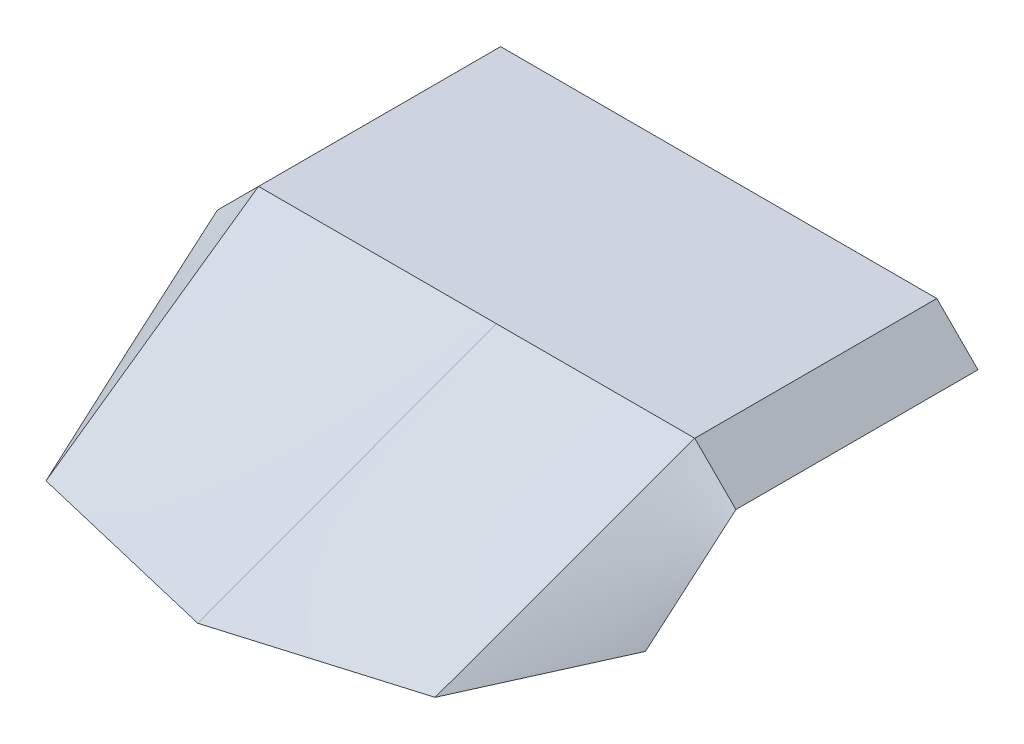
ISO-10303-21;
HEADER;
FILE_DESCRIPTION(('STEP AP214'),'2;1');
FILE_NAME('part.step','',(''),(''),'','','');
FILE_SCHEMA(('AUTOMOTIVE_DESIGN { 1 0 10303 214 1 1 1 1 }'));
ENDSEC;
DATA;
#1=APPLICATION_CONTEXT('core data for automotive mechanical design processes');
#2=APPLICATION_PROTOCOL_DEFINITION('international standard','automotive_design',2000,#1);
#3=PRODUCT_CONTEXT('',#1,'mechanical');
#4=PRODUCT('Part','Part','',(#3));
#5=PRODUCT_RELATED_PRODUCT_CATEGORY('part','',(#4));
#6=PRODUCT_DEFINITION_FORMATION('','',#4);
#7=PRODUCT_DEFINITION_CONTEXT('part definition',#1,'design');
#8=PRODUCT_DEFINITION('design','',#6,#7);
#9=PRODUCT_DEFINITION_SHAPE('','',#8);
#10=(LENGTH_UNIT() NAMED_UNIT(*) SI_UNIT(.MILLI.,.METRE.));
#11=(NAMED_UNIT(*) PLANE_ANGLE_UNIT() SI_UNIT($,.RADIAN.));
#12=(NAMED_UNIT(*) SI_UNIT($,.STERADIAN.) SOLID_ANGLE_UNIT());
#13=UNCERTAINTY_MEASURE_WITH_UNIT(LENGTH_MEASURE(1.E-05),#10,'distance_accuracy_value','');
#14=(GEOMETRIC_REPRESENTATION_CONTEXT(3) GLOBAL_UNCERTAINTY_ASSIGNED_CONTEXT((#13)) GLOBAL_UNIT_ASSIGNED_CONTEXT((#10,
#11,#12)) REPRESENTATION_CONTEXT('',''));
#15=CARTESIAN_POINT('',(0.,0.,0.));
#16=DIRECTION('',(0.,0.,1.));
#17=DIRECTION('',(1.,0.,0.));
#18=AXIS2_PLACEMENT_3D('',#15,#16,#17);
#19=CARTESIAN_POINT('',(0.,0.,30.));
#20=DIRECTION('',(0.,0.,1.));
#21=DIRECTION('',(1.,0.,0.));
#22=AXIS2_PLACEMENT_3D('',#19,#20,#21);
#23=PLANE('',#22);
#24=DIRECTION('',(-1.,0.,0.));
#25=VECTOR('',#24,1.);
#26=CARTESIAN_POINT('',(60.7145340187775,34.7887257541146,30.));
#27=LINE('',#26,#25);
#28=CARTESIAN_POINT('',(60.7145340187775,34.7887257541146,30.));
#29=VERTEX_POINT('',#28);
#30=CARTESIAN_POINT('',(-67.6565337930879,34.7887257541146,30.));
#31=VERTEX_POINT('',#30);
#32=EDGE_CURVE('E215',#29,#31,#27,.T.);
#33=ORIENTED_EDGE('',*,*,#32,.T.);
#34=DIRECTION('',(-0.707106781186547,-0.707106781186548,0.));
#35=VECTOR('',#34,1.);
#36=CARTESIAN_POINT('',(-67.6565337930879,34.7887257541146,30.));
#37=LINE('',#36,#35);
#38=CARTESIAN_POINT('',(-79.74918503639,22.6960745108126,30.));
#39=VERTEX_POINT('',#38);
#40=EDGE_CURVE('E74',#31,#39,#37,.T.);
#41=ORIENTED_EDGE('',*,*,#40,.T.);
#42=DIRECTION('',(0.923879532511283,-0.382683432365098,0.));
#43=VECTOR('',#42,1.);
#44=CARTESIAN_POINT('',(-79.7554783372609,22.6986812813854,30.));
#45=LINE('',#44,#43);
#46=CARTESIAN_POINT('',(-79.7554783372609,22.6986812813854,30.));
#47=VERTEX_POINT('',#46);
#48=EDGE_CURVE('E390',#47,#39,#45,.T.);
#49=ORIENTED_EDGE('',*,*,#48,.F.);
#50=DIRECTION('',(-0.707106781186547,-0.707106781186548,0.));
#51=VECTOR('',#50,1.);
#52=CARTESIAN_POINT('',(-67.6410122431936,34.8131473754527,30.));
#53=LINE('',#52,#51);
#54=CARTESIAN_POINT('',(-67.6410122431936,34.8131473754527,30.));
#55=VERTEX_POINT('',#54);
#56=EDGE_CURVE('E422',#55,#47,#53,.T.);
#57=ORIENTED_EDGE('',*,*,#56,.F.);
#58=DIRECTION('',(-1.,0.,0.));
#59=VECTOR('',#58,1.);
#60=CARTESIAN_POINT('',(60.7300555686718,34.8131473754527,30.));
#61=LINE('',#60,#59);
#62=CARTESIAN_POINT('',(2.36540760200717,34.8131473754527,30.));
#63=VERTEX_POINT('',#62);
#64=EDGE_CURVE('E772',#63,#55,#61,.T.);
#65=ORIENTED_EDGE('',*,*,#64,.F.);
#66=CARTESIAN_POINT('',(60.7300555686718,34.8131473754527,30.));
#67=VERTEX_POINT('',#66);
#68=EDGE_CURVE('E66',#67,#63,#61,.T.);
#69=ORIENTED_EDGE('',*,*,#68,.F.);
#70=DIRECTION('',(-0.707106781186548,0.707106781186548,0.));
#71=VECTOR('',#70,1.);
#72=CARTESIAN_POINT('',(72.844521662739,22.6986812813854,30.));
#73=LINE('',#72,#71);
#74=CARTESIAN_POINT('',(72.844521662739,22.6986812813854,30.));
#75=VERTEX_POINT('',#74);
#76=EDGE_CURVE('E675',#75,#67,#73,.T.);
#77=ORIENTED_EDGE('',*,*,#76,.F.);
#78=DIRECTION('',(0.923879532511285,0.382683432365094,0.));
#79=VECTOR('',#78,1.);
#80=CARTESIAN_POINT('',(67.8445216627391,20.62761346952,30.));
#81=LINE('',#80,#79);
#82=CARTESIAN_POINT('',(72.8162775754986,22.6869821973936,30.));
#83=VERTEX_POINT('',#82);
#84=EDGE_CURVE('E382',#83,#75,#81,.T.);
#85=ORIENTED_EDGE('',*,*,#84,.F.);
#86=DIRECTION('',(-0.707106781186547,0.707106781186547,0.));
#87=VECTOR('',#86,1.);
#88=CARTESIAN_POINT('',(72.8290001128448,22.6742596600474,30.));
#89=LINE('',#88,#87);
#90=EDGE_CURVE('E12',#83,#29,#89,.T.);
#91=ORIENTED_EDGE('',*,*,#90,.T.);
#92=EDGE_LOOP('',(#33,#41,#49,#57,#65,#69,#77,#85,#91));
#93=FACE_BOUND('',#92,.T.);
#94=ADVANCED_FACE('F56',(#93),#23,.F.);
#95=CARTESIAN_POINT('',(0.,0.,0.));
#96=DIRECTION('',(0.,-1.,0.));
#97=DIRECTION('',(0.,0.,-1.));
#98=AXIS2_PLACEMENT_3D('',#95,#96,#97);
#99=PLANE('',#98);
#100=DIRECTION('',(0.423612529517882,0.,0.905843488046065));
#101=VECTOR('',#100,1.);
#102=CARTESIAN_POINT('',(-58.677658095292,0.,101.503111576714));
#103=LINE('',#102,#101);
#104=CARTESIAN_POINT('',(-79.6036277648684,0.,56.7554895509702));
#105=VERTEX_POINT('',#104);
#106=CARTESIAN_POINT('',(-58.677658095292,0.,101.503111576714));
#107=VERTEX_POINT('',#106);
#108=EDGE_CURVE('E255',#105,#107,#103,.T.);
#109=ORIENTED_EDGE('',*,*,#108,.F.);
#110=DIRECTION('',(-1.,0.,0.));
#111=VECTOR('',#110,1.);
#112=CARTESIAN_POINT('',(-79.6036277648684,0.,56.7554895509702));
#113=LINE('',#112,#111);
#114=CARTESIAN_POINT('',(-74.6036277648684,0.,56.7554895509702));
#115=VERTEX_POINT('',#114);
#116=EDGE_CURVE('E595',#115,#105,#113,.T.);
#117=ORIENTED_EDGE('',*,*,#116,.F.);
#118=DIRECTION('',(-0.433093550106812,0.,-0.901348976177306));
#119=VECTOR('',#118,1.);
#120=CARTESIAN_POINT('',(-74.6036277648684,0.,56.7554895509702));
#121=LINE('',#120,#119);
#122=CARTESIAN_POINT('',(-55.1709183458875,0.,97.1986056741027));
#123=VERTEX_POINT('',#122);
#124=EDGE_CURVE('E583',#123,#115,#121,.T.);
#125=ORIENTED_EDGE('',*,*,#124,.F.);
#126=DIRECTION('',(-0.972775791288033,0.,-0.231748268351547));
#127=VECTOR('',#126,1.);
#128=CARTESIAN_POINT('',(-55.1709183458875,0.,97.1986056741027));
#129=LINE('',#128,#127);
#130=CARTESIAN_POINT('',(-0.195472783590218,0.,110.295625999873));
#131=VERTEX_POINT('',#130);
#132=EDGE_CURVE('E756',#131,#123,#129,.T.);
#133=ORIENTED_EDGE('',*,*,#132,.F.);
#134=DIRECTION('',(-0.958322681617719,0.,0.285688007968523));
#135=VECTOR('',#134,1.);
#136=CARTESIAN_POINT('',(-0.195472783590218,0.,110.295625999873));
#137=LINE('',#136,#135);
#138=CARTESIAN_POINT('',(50.137838924741,0.,95.2906346412864));
#139=VERTEX_POINT('',#138);
#140=EDGE_CURVE('E509',#139,#131,#137,.T.);
#141=ORIENTED_EDGE('',*,*,#140,.F.);
#142=DIRECTION('',(-0.420476191987089,0.,0.907303572114668));
#143=VECTOR('',#142,1.);
#144=CARTESIAN_POINT('',(50.137838924741,0.,95.2906346412864));
#145=LINE('',#144,#143);
#146=CARTESIAN_POINT('',(67.9963722351316,0.,56.7554895509701));
#147=VERTEX_POINT('',#146);
#148=EDGE_CURVE('E494',#147,#139,#145,.T.);
#149=ORIENTED_EDGE('',*,*,#148,.F.);
#150=DIRECTION('',(-1.,0.,0.));
#151=VECTOR('',#150,1.);
#152=CARTESIAN_POINT('',(67.9963722351316,0.,56.7554895509701));
#153=LINE('',#152,#151);
#154=CARTESIAN_POINT('',(72.9963722351316,0.,56.7554895509701));
#155=VERTEX_POINT('',#154);
#156=EDGE_CURVE('E677',#155,#147,#153,.T.);
#157=ORIENTED_EDGE('',*,*,#156,.F.);
#158=DIRECTION('',(0.411014378129852,0.,-0.911628861418138));
#159=VECTOR('',#158,1.);
#160=CARTESIAN_POINT('',(72.9963722351316,0.,56.7554895509701));
#161=LINE('',#160,#159);
#162=CARTESIAN_POINT('',(53.7565845323103,0.,99.4292904950052));
#163=VERTEX_POINT('',#162);
#164=EDGE_CURVE('E665',#163,#155,#161,.T.);
#165=ORIENTED_EDGE('',*,*,#164,.F.);
#166=DIRECTION('',(0.95832268161772,0.,-0.285688007968523));
#167=VECTOR('',#166,1.);
#168=CARTESIAN_POINT('',(53.7565845323103,0.,99.4292904950052));
#169=LINE('',#168,#167);
#170=CARTESIAN_POINT('',(-0.0509416868879859,0.,115.469988763074));
#171=VERTEX_POINT('',#170);
#172=EDGE_CURVE('E763',#171,#163,#169,.T.);
#173=ORIENTED_EDGE('',*,*,#172,.F.);
#174=DIRECTION('',(0.972775791288033,0.,0.231748268351548));
#175=VECTOR('',#174,1.);
#176=CARTESIAN_POINT('',(-0.0509416868879859,0.,115.469988763074));
#177=LINE('',#176,#175);
#178=EDGE_CURVE('E321',#107,#171,#177,.T.);
#179=ORIENTED_EDGE('',*,*,#178,.F.);
#180=EDGE_LOOP('',(#109,#117,#125,#133,#141,#149,#157,#165,#173,#179));
#181=FACE_BOUND('',#180,.T.);
#182=ADVANCED_FACE('F680',(#181),#99,.T.);
#183=CARTESIAN_POINT('',(-79.6036277648684,0.,56.7554895509702));
#184=CARTESIAN_POINT('',(-79.7554783372609,22.6986812813854,30.));
#185=CARTESIAN_POINT('',(-76.1159661532723,0.,64.2134265552608));
#186=CARTESIAN_POINT('',(-77.7364006549163,24.71775896373,30.));
#187=CARTESIAN_POINT('',(-72.6283045416763,0.,71.6713635595513));
#188=CARTESIAN_POINT('',(-75.7173229725717,26.7368366460746,30.));
#189=CARTESIAN_POINT('',(-65.6529813184841,0.,86.5872375681325));
#190=CARTESIAN_POINT('',(-71.6791676078826,30.7749920107637,30.));
#191=CARTESIAN_POINT('',(-62.165319706888,0.,94.0451745724231));
#192=CARTESIAN_POINT('',(-69.6600899255381,32.7940696931082,30.));
#193=CARTESIAN_POINT('',(-58.677658095292,0.,101.503111576714));
#194=CARTESIAN_POINT('',(-67.6410122431936,34.8131473754527,30.));
#195=B_SPLINE_SURFACE_WITH_KNOTS('',3,1,((#183,#184),(#185,#186),(#187,#188),(#189,#190),(#191,
#192),(#193,#194)),.UNSPECIFIED.,.F.,.F.,.F.,(4,2,4),(2,2),(0.,0.5,1.),(0.,1.),.UNSPECIFIED.);
#196=DIRECTION('',(-0.111998256804426,0.434994730275054,-0.893440526899078));
#197=VECTOR('',#196,1.);
#198=CARTESIAN_POINT('',(-63.1593351692428,17.4065736877263,65.7515557883568));
#199=LINE('',#198,#197);
#200=EDGE_CURVE('E327',#107,#55,#199,.T.);
#201=DIRECTION('',(0.00432780921793199,-0.646922566946734,0.762543416758956));
#202=VECTOR('',#201,1.);
#203=CARTESIAN_POINT('',(-79.6795530510646,11.3493406406927,43.3777447754851));
#204=LINE('',#203,#202);
#205=EDGE_CURVE('E600',#47,#105,#204,.T.);
#206=ORIENTED_EDGE('',*,*,#108,.T.);
#207=ORIENTED_EDGE('',*,*,#200,.T.);
#208=ORIENTED_EDGE('',*,*,#56,.T.);
#209=ORIENTED_EDGE('',*,*,#205,.T.);
#210=EDGE_LOOP('',(#206,#207,#208,#209));
#211=FACE_BOUND('',#210,.T.);
#212=ADVANCED_FACE('F342',(#211),#195,.T.);
#213=CARTESIAN_POINT('',(-58.677658095292,0.,101.503111576714));
#214=CARTESIAN_POINT('',(-67.6410122431936,34.8131473754527,30.));
#215=CARTESIAN_POINT('',(-48.9065386938913,0.,103.830924441107));
#216=CARTESIAN_POINT('',(-55.9732756023268,34.8131473754526,30.));
#217=CARTESIAN_POINT('',(-39.1354192924906,0.,106.158737305501));
#218=CARTESIAN_POINT('',(-44.30553896146,34.8131473754527,30.));
#219=CARTESIAN_POINT('',(-19.5931804896893,0.,110.814363034288));
#220=CARTESIAN_POINT('',(-20.9700656797264,34.8131473754527,30.));
#221=CARTESIAN_POINT('',(-9.82206108828865,0.,113.142175898681));
#222=CARTESIAN_POINT('',(-9.30232903885959,34.8131473754527,30.));
#223=CARTESIAN_POINT('',(-0.0509416868879859,0.,115.469988763074));
#224=CARTESIAN_POINT('',(2.36540760200717,34.8131473754527,30.));
#225=B_SPLINE_SURFACE_WITH_KNOTS('',3,1,((#213,#214),(#215,#216),(#217,#218),(#219,#220),(#221,
#222),(#223,#224)),.UNSPECIFIED.,.F.,.F.,.F.,(4,2,4),(2,2),(0.,0.5,1.),(0.,1.),.UNSPECIFIED.);
#226=DIRECTION('',(0.026173734113693,0.377093687263458,-0.92580520989493));
#227=VECTOR('',#226,1.);
#228=CARTESIAN_POINT('',(1.15723295755959,17.4065736877263,72.7349943815372));
#229=LINE('',#228,#227);
#230=EDGE_CURVE('E82',#171,#63,#229,.T.);
#231=ORIENTED_EDGE('',*,*,#178,.T.);
#232=ORIENTED_EDGE('',*,*,#230,.T.);
#233=ORIENTED_EDGE('',*,*,#64,.T.);
#234=ORIENTED_EDGE('',*,*,#200,.F.);
#235=EDGE_LOOP('',(#231,#232,#233,#234));
#236=FACE_BOUND('',#235,.T.);
#237=ADVANCED_FACE('F329',(#236),#225,.T.);
#238=CARTESIAN_POINT('',(-74.6036277648684,0.,56.7554895509702));
#239=CARTESIAN_POINT('',(-74.7554783372608,20.6276134695198,30.));
#240=CARTESIAN_POINT('',(-75.4369610982016,0.,56.7554895509702));
#241=CARTESIAN_POINT('',(-75.5888116705941,20.9727914381641,30.));
#242=CARTESIAN_POINT('',(-76.2702944315349,0.,56.7554895509702));
#243=CARTESIAN_POINT('',(-76.4221450039275,21.3179694068083,30.));
#244=CARTESIAN_POINT('',(-77.9369610982016,0.,56.7554895509702));
#245=CARTESIAN_POINT('',(-78.0888116705942,22.0083253440969,30.));
#246=CARTESIAN_POINT('',(-78.770294431535,0.,56.7554895509702));
#247=CARTESIAN_POINT('',(-78.9221450039275,22.3535033127411,30.));
#248=CARTESIAN_POINT('',(-79.6036277648684,0.,56.7554895509702));
#249=CARTESIAN_POINT('',(-79.7554783372609,22.6986812813854,30.));
#250=B_SPLINE_SURFACE_WITH_KNOTS('',3,1,((#238,#239),(#240,#241),(#242,#243),(#244,#245),(#246,
#247),(#248,#249)),.UNSPECIFIED.,.F.,.F.,.F.,(4,2,4),(2,2),(0.,0.5,1.),(0.,1.),.UNSPECIFIED.);
#251=CARTESIAN_POINT('',(-74.7554783372608,20.6276134695198,30.));
#252=VERTEX_POINT('',#251);
#253=EDGE_CURVE('E269',#39,#252,#45,.T.);
#254=DIRECTION('',(-0.00449471064483145,0.610568352678392,-0.791950809257629));
#255=VECTOR('',#254,1.);
#256=CARTESIAN_POINT('',(-74.6795530510646,10.3138067347599,43.3777447754851));
#257=LINE('',#256,#255);
#258=EDGE_CURVE('E580',#115,#252,#257,.T.);
#259=ORIENTED_EDGE('',*,*,#116,.T.);
#260=ORIENTED_EDGE('',*,*,#205,.F.);
#261=ORIENTED_EDGE('',*,*,#48,.T.);
#262=ORIENTED_EDGE('',*,*,#253,.T.);
#263=ORIENTED_EDGE('',*,*,#258,.F.);
#264=EDGE_LOOP('',(#259,#260,#261,#262,#263));
#265=FACE_BOUND('',#264,.T.);
#266=ADVANCED_FACE('F341',(#265),#250,.T.);
#267=CARTESIAN_POINT('',(-0.0509416868879828,0.,115.469988763074));
#268=CARTESIAN_POINT('',(2.36540760200717,34.8131473754527,30.));
#269=CARTESIAN_POINT('',(8.91697934964507,0.,112.79653905173));
#270=CARTESIAN_POINT('',(12.0928489297846,34.8131473754527,30.));
#271=CARTESIAN_POINT('',(17.8849003861781,0.,110.123089340385));
#272=CARTESIAN_POINT('',(21.8202902575621,34.8131473754527,30.));
#273=CARTESIAN_POINT('',(35.8207424592442,0.,104.776189917695));
#274=CARTESIAN_POINT('',(41.275172913117,34.8131473754527,30.));
#275=CARTESIAN_POINT('',(44.7886634957772,0.,102.10274020635));
#276=CARTESIAN_POINT('',(51.0026142408944,34.8131473754527,30.));
#277=CARTESIAN_POINT('',(53.7565845323103,0.,99.4292904950052));
#278=CARTESIAN_POINT('',(60.7300555686718,34.8131473754527,30.));
#279=B_SPLINE_SURFACE_WITH_KNOTS('',3,1,((#267,#268),(#269,#270),(#271,#272),(#273,#274),(#275,
#276),(#277,#278)),.UNSPECIFIED.,.F.,.F.,.F.,(4,2,4),(2,2),(0.,0.5,1.),(0.,1.),.UNSPECIFIED.);
#280=DIRECTION('',(0.0894254450586048,0.446432082632551,-0.890337849005889));
#281=VECTOR('',#280,1.);
#282=CARTESIAN_POINT('',(57.2433200504911,17.4065736877263,64.7146452475026));
#283=LINE('',#282,#281);
#284=EDGE_CURVE('E651',#163,#67,#283,.T.);
#285=ORIENTED_EDGE('',*,*,#172,.T.);
#286=ORIENTED_EDGE('',*,*,#284,.T.);
#287=ORIENTED_EDGE('',*,*,#68,.T.);
#288=ORIENTED_EDGE('',*,*,#230,.F.);
#289=EDGE_LOOP('',(#285,#286,#287,#288));
#290=FACE_BOUND('',#289,.T.);
#291=ADVANCED_FACE('F629',(#290),#279,.T.);
#292=CARTESIAN_POINT('',(53.7565845323103,0.,99.4292904950052));
#293=CARTESIAN_POINT('',(60.7300555686718,34.8131473754527,30.));
#294=CARTESIAN_POINT('',(56.9632158161138,0.,92.316990337666));
#295=CARTESIAN_POINT('',(62.7491332510163,32.7940696931081,30.));
#296=CARTESIAN_POINT('',(60.1698470999174,0.,85.2046901803268));
#297=CARTESIAN_POINT('',(64.7682109333609,30.7749920107636,30.));
#298=CARTESIAN_POINT('',(66.5831096675245,0.,70.9800898656485));
#299=CARTESIAN_POINT('',(68.8063662980499,26.7368366460745,30.));
#300=CARTESIAN_POINT('',(69.789740951328,0.,63.8677897083093));
#301=CARTESIAN_POINT('',(70.8254439803945,24.71775896373,30.));
#302=CARTESIAN_POINT('',(72.9963722351316,0.,56.7554895509701));
#303=CARTESIAN_POINT('',(72.844521662739,22.6986812813854,30.));
#304=B_SPLINE_SURFACE_WITH_KNOTS('',3,1,((#292,#293),(#294,#295),(#296,#297),(#298,#299),(#300,
#301),(#302,#303)),.UNSPECIFIED.,.F.,.F.,.F.,(4,2,4),(2,2),(0.,0.5,1.),(0.,1.),.UNSPECIFIED.);
#305=DIRECTION('',(-0.00432780921793279,0.646922566946736,-0.762543416758954));
#306=VECTOR('',#305,1.);
#307=CARTESIAN_POINT('',(72.9204469489353,11.3493406406927,43.3777447754851));
#308=LINE('',#307,#306);
#309=EDGE_CURVE('E487',#155,#75,#308,.T.);
#310=ORIENTED_EDGE('',*,*,#164,.T.);
#311=ORIENTED_EDGE('',*,*,#309,.T.);
#312=ORIENTED_EDGE('',*,*,#76,.T.);
#313=ORIENTED_EDGE('',*,*,#284,.F.);
#314=EDGE_LOOP('',(#310,#311,#312,#313));
#315=FACE_BOUND('',#314,.T.);
#316=ADVANCED_FACE('F458',(#315),#304,.T.);
#317=CARTESIAN_POINT('',(72.9963722351316,0.,56.7554895509701));
#318=CARTESIAN_POINT('',(72.844521662739,22.6986812813854,30.));
#319=CARTESIAN_POINT('',(72.1630389017982,0.,56.7554895509701));
#320=CARTESIAN_POINT('',(72.0111883294057,22.3535033127412,30.));
#321=CARTESIAN_POINT('',(71.3297055684648,0.,56.7554895509701));
#322=CARTESIAN_POINT('',(71.1778549960724,22.008325344097,30.));
#323=CARTESIAN_POINT('',(69.6630389017982,0.,56.7554895509701));
#324=CARTESIAN_POINT('',(69.5111883294057,21.3179694068085,30.));
#325=CARTESIAN_POINT('',(68.8297055684649,0.,56.7554895509701));
#326=CARTESIAN_POINT('',(68.6778549960724,20.9727914381642,30.));
#327=CARTESIAN_POINT('',(67.9963722351316,0.,56.7554895509701));
#328=CARTESIAN_POINT('',(67.8445216627391,20.62761346952,30.));
#329=B_SPLINE_SURFACE_WITH_KNOTS('',3,1,((#317,#318),(#319,#320),(#321,#322),(#323,#324),(#325,
#326),(#327,#328)),.UNSPECIFIED.,.F.,.F.,.F.,(4,2,4),(2,2),(0.,0.5,1.),(0.,1.),.UNSPECIFIED.);
#330=DIRECTION('',(-0.0044947106448335,0.610568352678395,-0.791950809257627));
#331=VECTOR('',#330,1.);
#332=CARTESIAN_POINT('',(67.9204469489353,10.31380673476,43.3777447754851));
#333=LINE('',#332,#331);
#334=CARTESIAN_POINT('',(67.8445216627391,20.62761346952,30.));
#335=VERTEX_POINT('',#334);
#336=EDGE_CURVE('E478',#147,#335,#333,.T.);
#337=EDGE_CURVE('E309',#335,#83,#81,.T.);
#338=ORIENTED_EDGE('',*,*,#156,.T.);
#339=ORIENTED_EDGE('',*,*,#336,.T.);
#340=ORIENTED_EDGE('',*,*,#337,.T.);
#341=ORIENTED_EDGE('',*,*,#84,.T.);
#342=ORIENTED_EDGE('',*,*,#309,.F.);
#343=EDGE_LOOP('',(#338,#339,#340,#341,#342));
#344=FACE_BOUND('',#343,.T.);
#345=ADVANCED_FACE('F445',(#344),#329,.T.);
#346=CARTESIAN_POINT('',(67.9963722351316,0.,56.7554895509701));
#347=CARTESIAN_POINT('',(67.8445216627391,20.62761346952,30.));
#348=CARTESIAN_POINT('',(65.0199500167331,0.,63.1780137326895));
#349=CARTESIAN_POINT('',(66.3135993450836,22.1585357871754,30.));
#350=CARTESIAN_POINT('',(62.0435277983347,0.,69.600537914409));
#351=CARTESIAN_POINT('',(64.7826770274282,23.6894581048308,30.));
#352=CARTESIAN_POINT('',(56.0906833615378,0.,82.4455862778477));
#353=CARTESIAN_POINT('',(61.7208323921173,26.7513027401417,30.));
#354=CARTESIAN_POINT('',(53.1142611431394,0.,88.868110459567));
#355=CARTESIAN_POINT('',(60.1899100744618,28.2822250577972,30.));
#356=CARTESIAN_POINT('',(50.137838924741,0.,95.2906346412864));
#357=CARTESIAN_POINT('',(58.6589877568063,29.8131473754527,30.));
#358=B_SPLINE_SURFACE_WITH_KNOTS('',3,1,((#346,#347),(#348,#349),(#350,#351),(#352,#353),(#354,
#355),(#356,#357)),.UNSPECIFIED.,.F.,.F.,.F.,(4,2,4),(2,2),(0.,0.5,1.),(0.,1.),.UNSPECIFIED.);
#359=DIRECTION('',(0.11789192728729,0.412471307784943,-0.903309976549948));
#360=VECTOR('',#359,1.);
#361=CARTESIAN_POINT('',(54.3984133407737,14.9065736877263,62.6453173206432));
#362=LINE('',#361,#360);
#363=CARTESIAN_POINT('',(58.6589877568063,29.8131473754527,30.));
#364=VERTEX_POINT('',#363);
#365=EDGE_CURVE('E486',#139,#364,#362,.T.);
#366=DIRECTION('',(0.707106781186548,-0.707106781186547,0.));
#367=VECTOR('',#366,1.);
#368=CARTESIAN_POINT('',(58.6589877568063,29.8131473754527,30.));
#369=LINE('',#368,#367);
#370=EDGE_CURVE('E60',#364,#335,#369,.T.);
#371=ORIENTED_EDGE('',*,*,#148,.T.);
#372=ORIENTED_EDGE('',*,*,#365,.T.);
#373=ORIENTED_EDGE('',*,*,#370,.T.);
#374=ORIENTED_EDGE('',*,*,#336,.F.);
#375=EDGE_LOOP('',(#371,#372,#373,#374));
#376=FACE_BOUND('',#375,.T.);
#377=ADVANCED_FACE('F457',(#376),#358,.T.);
#378=CARTESIAN_POINT('',(50.137838924741,0.,95.2906346412864));
#379=CARTESIAN_POINT('',(58.6589877568063,29.8131473754527,30.));
#380=CARTESIAN_POINT('',(41.7489536400191,0.,97.7914665343842));
#381=CARTESIAN_POINT('',(47.1175458968946,29.8131473754527,30.));
#382=CARTESIAN_POINT('',(33.3600683552973,0.,100.292298427482));
#383=CARTESIAN_POINT('',(35.5761040369829,29.8131473754527,30.));
#384=CARTESIAN_POINT('',(16.5822977858535,0.,105.293962213678));
#385=CARTESIAN_POINT('',(12.4932203171594,29.8131473754527,30.));
#386=CARTESIAN_POINT('',(8.19341250113165,0.,107.794794106776));
#387=CARTESIAN_POINT('',(0.951778457247679,29.8131473754527,30.));
#388=CARTESIAN_POINT('',(-0.195472783590218,0.,110.295625999873));
#389=CARTESIAN_POINT('',(-10.5896634026641,29.8131473754527,30.));
#390=B_SPLINE_SURFACE_WITH_KNOTS('',3,1,((#378,#379),(#380,#381),(#382,#383),(#384,#385),(#386,
#387),(#388,#389)),.UNSPECIFIED.,.F.,.F.,.F.,(4,2,4),(2,2),(0.,0.5,1.),(0.,1.),.UNSPECIFIED.);
#391=DIRECTION('',(-0.120470354251416,0.345539211016553,-0.930639321862448));
#392=VECTOR('',#391,1.);
#393=CARTESIAN_POINT('',(-5.39256809312716,14.9065736877263,70.1478129999367));
#394=LINE('',#393,#392);
#395=CARTESIAN_POINT('',(-10.5896634026641,29.8131473754527,30.));
#396=VERTEX_POINT('',#395);
#397=EDGE_CURVE('E504',#131,#396,#394,.T.);
#398=DIRECTION('',(1.,0.,0.));
#399=VECTOR('',#398,1.);
#400=CARTESIAN_POINT('',(-65.569944431328,29.8131473754527,30.));
#401=LINE('',#400,#399);
#402=EDGE_CURVE('E374',#396,#364,#401,.T.);
#403=ORIENTED_EDGE('',*,*,#140,.T.);
#404=ORIENTED_EDGE('',*,*,#397,.T.);
#405=ORIENTED_EDGE('',*,*,#402,.T.);
#406=ORIENTED_EDGE('',*,*,#365,.F.);
#407=EDGE_LOOP('',(#403,#404,#405,#406));
#408=FACE_BOUND('',#407,.T.);
#409=ADVANCED_FACE('F514',(#408),#390,.T.);
#410=CARTESIAN_POINT('',(-0.195472783590223,0.,110.295625999873));
#411=CARTESIAN_POINT('',(-10.5896634026641,29.8131473754527,30.));
#412=CARTESIAN_POINT('',(-9.35804704397309,0.,108.112789278912));
#413=CARTESIAN_POINT('',(-19.7530435741081,29.8131473754527,30.));
#414=CARTESIAN_POINT('',(-18.520621304356,0.,105.92995255795));
#415=CARTESIAN_POINT('',(-28.9164237455521,29.8131473754527,30.));
#416=CARTESIAN_POINT('',(-36.8457698251217,0.,101.564279116026));
#417=CARTESIAN_POINT('',(-47.24318408844,29.8131473754527,30.));
#418=CARTESIAN_POINT('',(-46.0083440855046,0.,99.3814423950645));
#419=CARTESIAN_POINT('',(-56.406564259884,29.8131473754527,30.));
#420=CARTESIAN_POINT('',(-55.1709183458875,0.,97.1986056741027));
#421=CARTESIAN_POINT('',(-65.569944431328,29.8131473754527,30.));
#422=B_SPLINE_SURFACE_WITH_KNOTS('',3,1,((#410,#411),(#412,#413),(#414,#415),(#416,#417),(#418,
#419),(#420,#421)),.UNSPECIFIED.,.F.,.F.,.F.,(4,2,4),(2,2),(0.,0.5,1.),(0.,1.),.UNSPECIFIED.);
#423=DIRECTION('',(-0.14005989384847,0.401540127160651,-0.905068368917489));
#424=VECTOR('',#423,1.);
#425=CARTESIAN_POINT('',(-60.3704313886078,14.9065736877263,63.5993028370513));
#426=LINE('',#425,#424);
#427=CARTESIAN_POINT('',(-65.569944431328,29.8131473754527,30.));
#428=VERTEX_POINT('',#427);
#429=EDGE_CURVE('E585',#123,#428,#426,.T.);
#430=EDGE_CURVE('E376',#428,#396,#401,.T.);
#431=ORIENTED_EDGE('',*,*,#132,.T.);
#432=ORIENTED_EDGE('',*,*,#429,.T.);
#433=ORIENTED_EDGE('',*,*,#430,.T.);
#434=ORIENTED_EDGE('',*,*,#397,.F.);
#435=EDGE_LOOP('',(#431,#432,#433,#434));
#436=FACE_BOUND('',#435,.T.);
#437=ADVANCED_FACE('F525',(#436),#422,.T.);
#438=CARTESIAN_POINT('',(-55.1709183458875,0.,97.1986056741027));
#439=CARTESIAN_POINT('',(-65.569944431328,29.8131473754527,30.));
#440=CARTESIAN_POINT('',(-58.409703249051,0.,90.4580863202472));
#441=CARTESIAN_POINT('',(-67.1008667489834,28.2822250577972,30.));
#442=CARTESIAN_POINT('',(-61.6484881522145,0.,83.7175669663918));
#443=CARTESIAN_POINT('',(-68.6317890666389,26.7513027401417,30.));
#444=CARTESIAN_POINT('',(-68.1260579585415,0.,70.236528258681));
#445=CARTESIAN_POINT('',(-71.6936337019499,23.6894581048308,30.));
#446=CARTESIAN_POINT('',(-71.3648428617049,0.,63.4960089048256));
#447=CARTESIAN_POINT('',(-73.2245560196053,22.1585357871753,30.));
#448=CARTESIAN_POINT('',(-74.6036277648684,0.,56.7554895509702));
#449=CARTESIAN_POINT('',(-74.7554783372608,20.6276134695198,30.));
#450=B_SPLINE_SURFACE_WITH_KNOTS('',3,1,((#438,#439),(#440,#441),(#442,#443),(#444,#445),(#446,
#447),(#448,#449)),.UNSPECIFIED.,.F.,.F.,.F.,(4,2,4),(2,2),(0.,0.5,1.),(0.,1.),.UNSPECIFIED.);
#451=DIRECTION('',(0.707106781186548,0.707106781186547,0.));
#452=VECTOR('',#451,1.);
#453=CARTESIAN_POINT('',(-74.7554783372608,20.6276134695198,30.));
#454=LINE('',#453,#452);
#455=EDGE_CURVE('E384',#252,#428,#454,.T.);
#456=ORIENTED_EDGE('',*,*,#124,.T.);
#457=ORIENTED_EDGE('',*,*,#258,.T.);
#458=ORIENTED_EDGE('',*,*,#455,.T.);
#459=ORIENTED_EDGE('',*,*,#429,.F.);
#460=EDGE_LOOP('',(#456,#457,#458,#459));
#461=FACE_BOUND('',#460,.T.);
#462=ADVANCED_FACE('F535',(#461),#450,.T.);
#463=CARTESIAN_POINT('',(-67.6565337930879,34.7887257541146,-41.26));
#464=DIRECTION('',(-0.707106781186548,0.707106781186547,0.));
#465=DIRECTION('',(-0.707106781186547,-0.707106781186548,0.));
#466=AXIS2_PLACEMENT_3D('',#463,#464,#465);
#467=PLANE('',#466);
#468=ORIENTED_EDGE('',*,*,#40,.F.);
#469=DIRECTION('',(0.,0.,1.));
#470=VECTOR('',#469,1.);
#471=CARTESIAN_POINT('',(-67.6565337930879,34.7887257541146,-41.26));
#472=LINE('',#471,#470);
#473=CARTESIAN_POINT('',(-67.6565337930879,34.7887257541146,-41.26));
#474=VERTEX_POINT('',#473);
#475=EDGE_CURVE('E214',#474,#31,#472,.T.);
#476=ORIENTED_EDGE('',*,*,#475,.F.);
#477=DIRECTION('',(-0.707106781186547,-0.707106781186548,0.));
#478=VECTOR('',#477,1.);
#479=CARTESIAN_POINT('',(-67.6565337930879,34.7887257541146,-41.26));
#480=LINE('',#479,#478);
#481=CARTESIAN_POINT('',(-79.7709998871552,22.6742596600474,-41.26));
#482=VERTEX_POINT('',#481);
#483=EDGE_CURVE('E207',#474,#482,#480,.T.);
#484=ORIENTED_EDGE('',*,*,#483,.T.);
#485=DIRECTION('',(0.,0.,1.));
#486=VECTOR('',#485,1.);
#487=CARTESIAN_POINT('',(-79.7709998871552,22.6742596600474,-41.26));
#488=LINE('',#487,#486);
#489=CARTESIAN_POINT('',(-79.7709998871552,22.6742596600474,30.));
#490=VERTEX_POINT('',#489);
#491=EDGE_CURVE('E192',#482,#490,#488,.T.);
#492=ORIENTED_EDGE('',*,*,#491,.T.);
#493=EDGE_CURVE('E242',#39,#490,#37,.T.);
#494=ORIENTED_EDGE('',*,*,#493,.F.);
#495=EDGE_LOOP('',(#468,#476,#484,#492,#494));
#496=FACE_BOUND('',#495,.T.);
#497=ADVANCED_FACE('F213',(#496),#467,.T.);
#498=CARTESIAN_POINT('',(60.7145340187775,34.7887257541146,-41.26));
#499=DIRECTION('',(0.,1.,0.));
#500=DIRECTION('',(-1.,0.,0.));
#501=AXIS2_PLACEMENT_3D('',#498,#499,#500);
#502=PLANE('',#501);
#503=ORIENTED_EDGE('',*,*,#32,.F.);
#504=DIRECTION('',(0.,0.,1.));
#505=VECTOR('',#504,1.);
#506=CARTESIAN_POINT('',(60.7145340187775,34.7887257541146,-41.26));
#507=LINE('',#506,#505);
#508=CARTESIAN_POINT('',(60.7145340187775,34.7887257541146,-41.26));
#509=VERTEX_POINT('',#508);
#510=EDGE_CURVE('E253',#509,#29,#507,.T.);
#511=ORIENTED_EDGE('',*,*,#510,.F.);
#512=DIRECTION('',(-1.,0.,0.));
#513=VECTOR('',#512,1.);
#514=CARTESIAN_POINT('',(60.7145340187775,34.7887257541146,-41.26));
#515=LINE('',#514,#513);
#516=EDGE_CURVE('E200',#509,#474,#515,.T.);
#517=ORIENTED_EDGE('',*,*,#516,.T.);
#518=ORIENTED_EDGE('',*,*,#475,.T.);
#519=EDGE_LOOP('',(#503,#511,#517,#518));
#520=FACE_BOUND('',#519,.T.);
#521=ADVANCED_FACE('F285',(#520),#502,.T.);
#522=CARTESIAN_POINT('',(72.8290001128448,22.6742596600474,-41.26));
#523=DIRECTION('',(0.707106781186548,0.707106781186548,0.));
#524=DIRECTION('',(-0.707106781186548,0.707106781186548,0.));
#525=AXIS2_PLACEMENT_3D('',#522,#523,#524);
#526=PLANE('',#525);
#527=CARTESIAN_POINT('',(72.8290001128448,22.6742596600474,30.));
#528=VERTEX_POINT('',#527);
#529=EDGE_CURVE('E218',#528,#83,#89,.T.);
#530=ORIENTED_EDGE('',*,*,#529,.F.);
#531=DIRECTION('',(0.,0.,1.));
#532=VECTOR('',#531,1.);
#533=CARTESIAN_POINT('',(72.8290001128448,22.6742596600474,-41.26));
#534=LINE('',#533,#532);
#535=CARTESIAN_POINT('',(72.8290001128448,22.6742596600474,-41.26));
#536=VERTEX_POINT('',#535);
#537=EDGE_CURVE('E251',#536,#528,#534,.T.);
#538=ORIENTED_EDGE('',*,*,#537,.F.);
#539=DIRECTION('',(-0.707106781186547,0.707106781186547,0.));
#540=VECTOR('',#539,1.);
#541=CARTESIAN_POINT('',(72.8290001128448,22.6742596600474,-41.26));
#542=LINE('',#541,#540);
#543=EDGE_CURVE('E231',#536,#509,#542,.T.);
#544=ORIENTED_EDGE('',*,*,#543,.T.);
#545=ORIENTED_EDGE('',*,*,#510,.T.);
#546=ORIENTED_EDGE('',*,*,#90,.F.);
#547=EDGE_LOOP('',(#530,#538,#544,#545,#546));
#548=FACE_BOUND('',#547,.T.);
#549=ADVANCED_FACE('F805',(#548),#526,.T.);
#550=CARTESIAN_POINT('',(67.8290001128448,20.6031918481819,-41.26));
#551=DIRECTION('',(0.382683432365089,-0.923879532511287,0.));
#552=DIRECTION('',(0.923879532511287,0.382683432365089,0.));
#553=AXIS2_PLACEMENT_3D('',#550,#551,#552);
#554=PLANE('',#553);
#555=DIRECTION('',(0.923879532511287,0.382683432365089,0.));
#556=VECTOR('',#555,1.);
#557=CARTESIAN_POINT('',(67.8290001128448,20.6031918481819,30.));
#558=LINE('',#557,#556);
#559=CARTESIAN_POINT('',(67.8290001128448,20.6031918481819,30.));
#560=VERTEX_POINT('',#559);
#561=EDGE_CURVE('E259',#560,#528,#558,.T.);
#562=ORIENTED_EDGE('',*,*,#561,.F.);
#563=DIRECTION('',(0.,0.,1.));
#564=VECTOR('',#563,1.);
#565=CARTESIAN_POINT('',(67.8290001128448,20.6031918481819,-41.26));
#566=LINE('',#565,#564);
#567=CARTESIAN_POINT('',(67.8290001128448,20.6031918481819,-41.26));
#568=VERTEX_POINT('',#567);
#569=EDGE_CURVE('E249',#568,#560,#566,.T.);
#570=ORIENTED_EDGE('',*,*,#569,.F.);
#571=DIRECTION('',(0.923879532511287,0.382683432365089,0.));
#572=VECTOR('',#571,1.);
#573=CARTESIAN_POINT('',(67.8290001128448,20.6031918481819,-41.26));
#574=LINE('',#573,#572);
#575=EDGE_CURVE('E228',#568,#536,#574,.T.);
#576=ORIENTED_EDGE('',*,*,#575,.T.);
#577=ORIENTED_EDGE('',*,*,#537,.T.);
#578=EDGE_LOOP('',(#562,#570,#576,#577));
#579=FACE_BOUND('',#578,.T.);
#580=ADVANCED_FACE('F811',(#579),#554,.T.);
#581=CARTESIAN_POINT('',(58.643466206912,29.7887257541146,-41.26));
#582=DIRECTION('',(-0.707106781186547,-0.707106781186548,0.));
#583=DIRECTION('',(0.707106781186548,-0.707106781186547,0.));
#584=AXIS2_PLACEMENT_3D('',#581,#582,#583);
#585=PLANE('',#584);
#586=DIRECTION('',(0.707106781186548,-0.707106781186547,0.));
#587=VECTOR('',#586,1.);
#588=CARTESIAN_POINT('',(58.643466206912,29.7887257541146,30.));
#589=LINE('',#588,#587);
#590=CARTESIAN_POINT('',(58.643466206912,29.7887257541146,30.));
#591=VERTEX_POINT('',#590);
#592=EDGE_CURVE('E815',#591,#560,#589,.T.);
#593=ORIENTED_EDGE('',*,*,#592,.F.);
#594=DIRECTION('',(0.,0.,1.));
#595=VECTOR('',#594,1.);
#596=CARTESIAN_POINT('',(58.643466206912,29.7887257541146,-41.26));
#597=LINE('',#596,#595);
#598=CARTESIAN_POINT('',(58.643466206912,29.7887257541146,-41.26));
#599=VERTEX_POINT('',#598);
#600=EDGE_CURVE('E247',#599,#591,#597,.T.);
#601=ORIENTED_EDGE('',*,*,#600,.F.);
#602=DIRECTION('',(0.707106781186548,-0.707106781186547,0.));
#603=VECTOR('',#602,1.);
#604=CARTESIAN_POINT('',(58.643466206912,29.7887257541146,-41.26));
#605=LINE('',#604,#603);
#606=EDGE_CURVE('E225',#599,#568,#605,.T.);
#607=ORIENTED_EDGE('',*,*,#606,.T.);
#608=ORIENTED_EDGE('',*,*,#569,.T.);
#609=EDGE_LOOP('',(#593,#601,#607,#608));
#610=FACE_BOUND('',#609,.T.);
#611=ADVANCED_FACE('F814',(#610),#585,.T.);
#612=CARTESIAN_POINT('',(-65.5854659812219,29.7887257541146,-41.26));
#613=DIRECTION('',(0.,-1.,0.));
#614=DIRECTION('',(0.,0.,-1.));
#615=AXIS2_PLACEMENT_3D('',#612,#613,#614);
#616=PLANE('',#615);
#617=DIRECTION('',(1.,0.,0.));
#618=VECTOR('',#617,1.);
#619=CARTESIAN_POINT('',(-65.5854659812219,29.7887257541146,30.));
#620=LINE('',#619,#618);
#621=CARTESIAN_POINT('',(-65.5854659812219,29.7887257541146,30.));
#622=VERTEX_POINT('',#621);
#623=EDGE_CURVE('E820',#622,#591,#620,.T.);
#624=ORIENTED_EDGE('',*,*,#623,.F.);
#625=DIRECTION('',(0.,0.,1.));
#626=VECTOR('',#625,1.);
#627=CARTESIAN_POINT('',(-65.5854659812219,29.7887257541146,-41.26));
#628=LINE('',#627,#626);
#629=CARTESIAN_POINT('',(-65.5854659812219,29.7887257541146,-41.26));
#630=VERTEX_POINT('',#629);
#631=EDGE_CURVE('E245',#630,#622,#628,.T.);
#632=ORIENTED_EDGE('',*,*,#631,.F.);
#633=DIRECTION('',(1.,0.,0.));
#634=VECTOR('',#633,1.);
#635=CARTESIAN_POINT('',(-65.5854659812219,29.7887257541146,-41.26));
#636=LINE('',#635,#634);
#637=EDGE_CURVE('E222',#630,#599,#636,.T.);
#638=ORIENTED_EDGE('',*,*,#637,.T.);
#639=ORIENTED_EDGE('',*,*,#600,.T.);
#640=EDGE_LOOP('',(#624,#632,#638,#639));
#641=FACE_BOUND('',#640,.T.);
#642=ADVANCED_FACE('F819',(#641),#616,.T.);
#643=CARTESIAN_POINT('',(-74.7709998871547,20.6031918481817,-41.26));
#644=DIRECTION('',(0.707106781186547,-0.707106781186547,0.));
#645=DIRECTION('',(0.707106781186548,0.707106781186548,0.));
#646=AXIS2_PLACEMENT_3D('',#643,#644,#645);
#647=PLANE('',#646);
#648=DIRECTION('',(0.707106781186548,0.707106781186548,0.));
#649=VECTOR('',#648,1.);
#650=CARTESIAN_POINT('',(-74.7709998871547,20.6031918481817,30.));
#651=LINE('',#650,#649);
#652=CARTESIAN_POINT('',(-74.7709998871547,20.6031918481817,30.));
#653=VERTEX_POINT('',#652);
#654=EDGE_CURVE('E825',#653,#622,#651,.T.);
#655=ORIENTED_EDGE('',*,*,#654,.F.);
#656=DIRECTION('',(0.,0.,1.));
#657=VECTOR('',#656,1.);
#658=CARTESIAN_POINT('',(-74.7709998871547,20.6031918481817,-41.26));
#659=LINE('',#658,#657);
#660=CARTESIAN_POINT('',(-74.7709998871547,20.6031918481817,-41.26));
#661=VERTEX_POINT('',#660);
#662=EDGE_CURVE('E199',#661,#653,#659,.T.);
#663=ORIENTED_EDGE('',*,*,#662,.F.);
#664=DIRECTION('',(0.707106781186548,0.707106781186548,0.));
#665=VECTOR('',#664,1.);
#666=CARTESIAN_POINT('',(-74.7709998871547,20.6031918481817,-41.26));
#667=LINE('',#666,#665);
#668=EDGE_CURVE('E211',#661,#630,#667,.T.);
#669=ORIENTED_EDGE('',*,*,#668,.T.);
#670=ORIENTED_EDGE('',*,*,#631,.T.);
#671=EDGE_LOOP('',(#655,#663,#669,#670));
#672=FACE_BOUND('',#671,.T.);
#673=ADVANCED_FACE('F824',(#672),#647,.T.);
#674=CARTESIAN_POINT('',(-79.7709998871552,22.6742596600474,-41.26));
#675=DIRECTION('',(-0.382683432365088,-0.923879532511288,0.));
#676=DIRECTION('',(0.923879532511288,-0.382683432365088,0.));
#677=AXIS2_PLACEMENT_3D('',#674,#675,#676);
#678=PLANE('',#677);
#679=DIRECTION('',(0.923879532511287,-0.382683432365088,0.));
#680=VECTOR('',#679,1.);
#681=CARTESIAN_POINT('',(-79.7709998871552,22.6742596600474,30.));
#682=LINE('',#681,#680);
#683=EDGE_CURVE('E197',#490,#653,#682,.T.);
#684=ORIENTED_EDGE('',*,*,#683,.F.);
#685=ORIENTED_EDGE('',*,*,#491,.F.);
#686=DIRECTION('',(0.923879532511287,-0.382683432365088,0.));
#687=VECTOR('',#686,1.);
#688=CARTESIAN_POINT('',(-79.7709998871552,22.6742596600474,-41.26));
#689=LINE('',#688,#687);
#690=EDGE_CURVE('E195',#482,#661,#689,.T.);
#691=ORIENTED_EDGE('',*,*,#690,.T.);
#692=ORIENTED_EDGE('',*,*,#662,.T.);
#693=EDGE_LOOP('',(#684,#685,#691,#692));
#694=FACE_BOUND('',#693,.T.);
#695=ADVANCED_FACE('F194',(#694),#678,.T.);
#696=CARTESIAN_POINT('',(0.,0.,-41.26));
#697=DIRECTION('',(0.,0.,1.));
#698=DIRECTION('',(1.,0.,0.));
#699=AXIS2_PLACEMENT_3D('',#696,#697,#698);
#700=PLANE('',#699);
#701=ORIENTED_EDGE('',*,*,#483,.F.);
#702=ORIENTED_EDGE('',*,*,#516,.F.);
#703=ORIENTED_EDGE('',*,*,#543,.F.);
#704=ORIENTED_EDGE('',*,*,#575,.F.);
#705=ORIENTED_EDGE('',*,*,#606,.F.);
#706=ORIENTED_EDGE('',*,*,#637,.F.);
#707=ORIENTED_EDGE('',*,*,#668,.F.);
#708=ORIENTED_EDGE('',*,*,#690,.F.);
#709=EDGE_LOOP('',(#701,#702,#703,#704,#705,#706,#707,#708));
#710=FACE_BOUND('',#709,.T.);
#711=ADVANCED_FACE('F205',(#710),#700,.F.);
#712=CARTESIAN_POINT('',(0.,0.,30.));
#713=DIRECTION('',(0.,0.,1.));
#714=DIRECTION('',(1.,0.,0.));
#715=AXIS2_PLACEMENT_3D('',#712,#713,#714);
#716=PLANE('',#715);
#717=ORIENTED_EDGE('',*,*,#529,.T.);
#718=ORIENTED_EDGE('',*,*,#337,.F.);
#719=ORIENTED_EDGE('',*,*,#370,.F.);
#720=ORIENTED_EDGE('',*,*,#402,.F.);
#721=ORIENTED_EDGE('',*,*,#430,.F.);
#722=ORIENTED_EDGE('',*,*,#455,.F.);
#723=ORIENTED_EDGE('',*,*,#253,.F.);
#724=ORIENTED_EDGE('',*,*,#493,.T.);
#725=ORIENTED_EDGE('',*,*,#683,.T.);
#726=ORIENTED_EDGE('',*,*,#654,.T.);
#727=ORIENTED_EDGE('',*,*,#623,.T.);
#728=ORIENTED_EDGE('',*,*,#592,.T.);
#729=ORIENTED_EDGE('',*,*,#561,.T.);
#730=EDGE_LOOP('',(#717,#718,#719,#720,#721,#722,#723,#724,#725,#726,#727,#728,#729));
#731=FACE_BOUND('',#730,.T.);
#732=ADVANCED_FACE('F275',(#731),#716,.T.);
#733=CLOSED_SHELL('',(#94,#182,#212,#237,#266,#291,#316,#345,#377,#409,#437,#462,#497,#521,#549,
#580,#611,#642,#673,#695,#711,#732));
#734=MANIFOLD_SOLID_BREP('B2',#733);
#735=ADVANCED_BREP_SHAPE_REPRESENTATION('',(#18,#734),#14);
#736=SHAPE_DEFINITION_REPRESENTATION(#9,#735);
ENDSEC;
END-ISO-10303-21;
